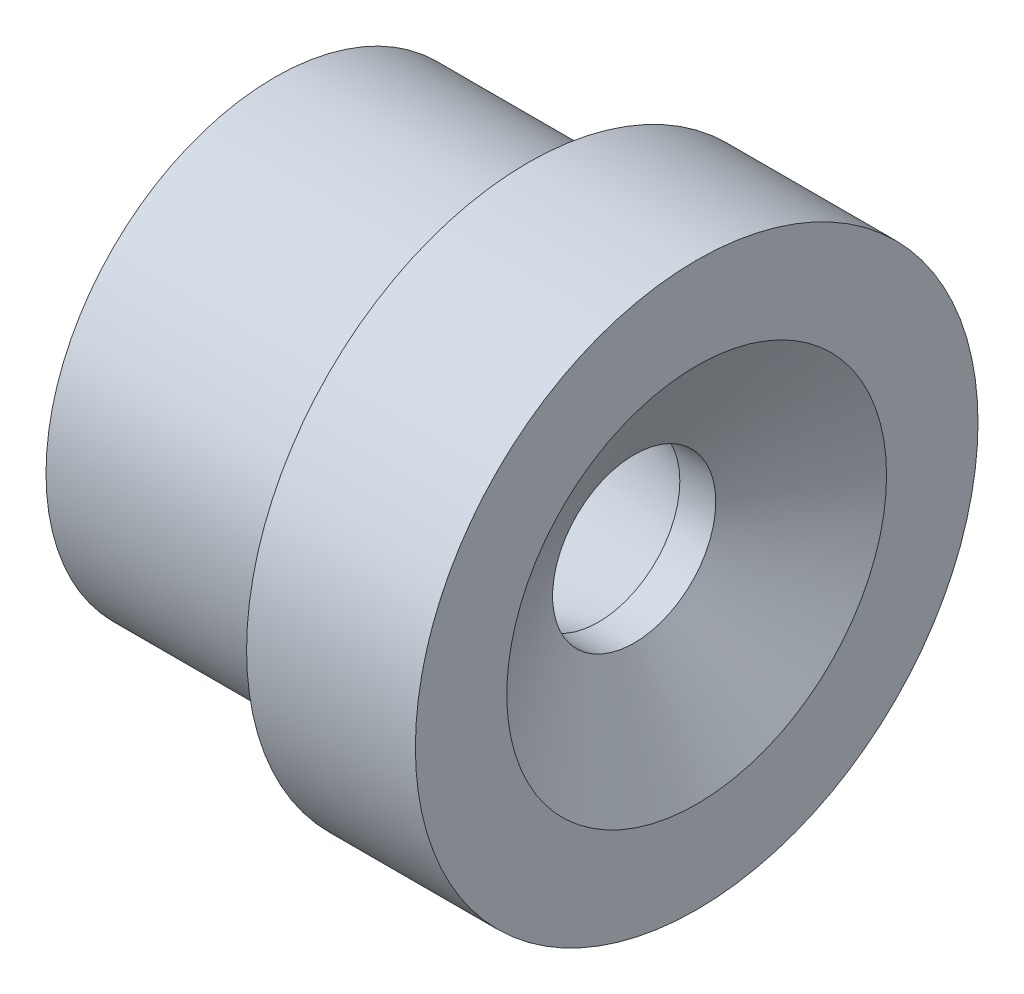
ISO-10303-21;
HEADER;
FILE_DESCRIPTION(('STEP AP214'),'2;1');
FILE_NAME('part.step','',(''),(''),'','','');
FILE_SCHEMA(('AUTOMOTIVE_DESIGN { 1 0 10303 214 1 1 1 1 }'));
ENDSEC;
DATA;
#1=APPLICATION_CONTEXT('core data for automotive mechanical design processes');
#2=APPLICATION_PROTOCOL_DEFINITION('international standard','automotive_design',2000,#1);
#3=PRODUCT_CONTEXT('',#1,'mechanical');
#4=PRODUCT('Part','Part','',(#3));
#5=PRODUCT_RELATED_PRODUCT_CATEGORY('part','',(#4));
#6=PRODUCT_DEFINITION_FORMATION('','',#4);
#7=PRODUCT_DEFINITION_CONTEXT('part definition',#1,'design');
#8=PRODUCT_DEFINITION('design','',#6,#7);
#9=PRODUCT_DEFINITION_SHAPE('','',#8);
#10=(LENGTH_UNIT() NAMED_UNIT(*) SI_UNIT(.MILLI.,.METRE.));
#11=(NAMED_UNIT(*) PLANE_ANGLE_UNIT() SI_UNIT($,.RADIAN.));
#12=(NAMED_UNIT(*) SI_UNIT($,.STERADIAN.) SOLID_ANGLE_UNIT());
#13=UNCERTAINTY_MEASURE_WITH_UNIT(LENGTH_MEASURE(1.E-05),#10,'distance_accuracy_value','');
#14=(GEOMETRIC_REPRESENTATION_CONTEXT(3) GLOBAL_UNCERTAINTY_ASSIGNED_CONTEXT((#13)) GLOBAL_UNIT_ASSIGNED_CONTEXT((#10,
#11,#12)) REPRESENTATION_CONTEXT('',''));
#15=CARTESIAN_POINT('',(0.,0.,0.));
#16=DIRECTION('',(0.,0.,1.));
#17=DIRECTION('',(1.,0.,0.));
#18=AXIS2_PLACEMENT_3D('',#15,#16,#17);
#19=CARTESIAN_POINT('',(5.11872970120267,0.,-12.7));
#20=DIRECTION('',(1.,0.,0.));
#21=DIRECTION('',(0.,0.,-1.));
#22=AXIS2_PLACEMENT_3D('',#19,#20,#21);
#23=CYLINDRICAL_SURFACE('',#22,12.7);
#24=CARTESIAN_POINT('',(0.,0.,-12.7));
#25=DIRECTION('',(1.,0.,0.));
#26=DIRECTION('',(0.,0.,-1.));
#27=AXIS2_PLACEMENT_3D('',#24,#25,#26);
#28=CIRCLE('',#27,12.7);
#29=CARTESIAN_POINT('',(0.,0.,-25.4));
#30=VERTEX_POINT('',#29);
#31=EDGE_CURVE('E10',#30,#30,#28,.T.);
#32=ORIENTED_EDGE('',*,*,#31,.F.);
#33=EDGE_LOOP('',(#32));
#34=FACE_BOUND('',#33,.T.);
#35=CARTESIAN_POINT('',(-7.62,0.,-12.7));
#36=DIRECTION('',(1.,0.,0.));
#37=DIRECTION('',(0.,0.,-1.));
#38=AXIS2_PLACEMENT_3D('',#35,#36,#37);
#39=CIRCLE('',#38,12.7);
#40=CARTESIAN_POINT('',(-7.62000000000001,0.,-25.4));
#41=VERTEX_POINT('',#40);
#42=EDGE_CURVE('E70',#41,#41,#39,.T.);
#43=ORIENTED_EDGE('',*,*,#42,.T.);
#44=EDGE_LOOP('',(#43));
#45=FACE_BOUND('',#44,.T.);
#46=ADVANCED_FACE('F39',(#34,#45),#23,.T.);
#47=CARTESIAN_POINT('',(0.,0.,0.));
#48=DIRECTION('',(-1.,0.,0.));
#49=DIRECTION('',(0.,0.,1.));
#50=AXIS2_PLACEMENT_3D('',#47,#48,#49);
#51=PLANE('',#50);
#52=CARTESIAN_POINT('',(0.,0.,-12.7));
#53=DIRECTION('',(1.,0.,0.));
#54=DIRECTION('',(0.,0.,-1.));
#55=AXIS2_PLACEMENT_3D('',#52,#53,#54);
#56=CIRCLE('',#55,8.5725);
#57=CARTESIAN_POINT('',(0.,0.,-21.2725));
#58=VERTEX_POINT('',#57);
#59=EDGE_CURVE('E44',#58,#58,#56,.T.);
#60=ORIENTED_EDGE('',*,*,#59,.F.);
#61=EDGE_LOOP('',(#60));
#62=FACE_BOUND('',#61,.T.);
#63=ORIENTED_EDGE('',*,*,#31,.T.);
#64=EDGE_LOOP('',(#63));
#65=FACE_BOUND('',#64,.T.);
#66=ADVANCED_FACE('F102',(#62,#65),#51,.F.);
#67=CARTESIAN_POINT('',(0.,0.,-12.7));
#68=DIRECTION('',(1.,0.,0.));
#69=DIRECTION('',(0.,0.,-1.));
#70=AXIS2_PLACEMENT_3D('',#67,#68,#69);
#71=CONICAL_SURFACE('',#70,8.5725,1.0471975511966);
#72=CARTESIAN_POINT('',(-2.82295414120266,0.,-12.7));
#73=DIRECTION('',(1.,0.,0.));
#74=DIRECTION('',(0.,0.,-1.));
#75=AXIS2_PLACEMENT_3D('',#72,#73,#74);
#76=CIRCLE('',#75,3.683);
#77=CARTESIAN_POINT('',(-2.82295414120267,0.,-16.383));
#78=VERTEX_POINT('',#77);
#79=EDGE_CURVE('E47',#78,#78,#76,.T.);
#80=ORIENTED_EDGE('',*,*,#79,.F.);
#81=EDGE_LOOP('',(#80));
#82=FACE_BOUND('',#81,.T.);
#83=ORIENTED_EDGE('',*,*,#59,.T.);
#84=EDGE_LOOP('',(#83));
#85=FACE_BOUND('',#84,.T.);
#86=ADVANCED_FACE('F97',(#82,#85),#71,.F.);
#87=CARTESIAN_POINT('',(5.11872970120267,0.,-12.7));
#88=DIRECTION('',(1.,0.,0.));
#89=DIRECTION('',(0.,0.,-1.));
#90=AXIS2_PLACEMENT_3D('',#87,#88,#89);
#91=CYLINDRICAL_SURFACE('',#90,3.683);
#92=CARTESIAN_POINT('',(-4.44347414120266,0.,-12.7));
#93=DIRECTION('',(1.,0.,0.));
#94=DIRECTION('',(0.,0.,-1.));
#95=AXIS2_PLACEMENT_3D('',#92,#93,#94);
#96=CIRCLE('',#95,3.683);
#97=CARTESIAN_POINT('',(-4.44347414120266,0.,-16.383));
#98=VERTEX_POINT('',#97);
#99=EDGE_CURVE('E52',#98,#98,#96,.T.);
#100=ORIENTED_EDGE('',*,*,#99,.F.);
#101=EDGE_LOOP('',(#100));
#102=FACE_BOUND('',#101,.T.);
#103=ORIENTED_EDGE('',*,*,#79,.T.);
#104=EDGE_LOOP('',(#103));
#105=FACE_BOUND('',#104,.T.);
#106=ADVANCED_FACE('F91',(#102,#105),#91,.F.);
#107=CARTESIAN_POINT('',(-4.44347414120266,0.,-12.7));
#108=DIRECTION('',(-1.,0.,0.));
#109=DIRECTION('',(0.,0.,1.));
#110=AXIS2_PLACEMENT_3D('',#107,#108,#109);
#111=CONICAL_SURFACE('',#110,3.683,0.26179938779915);
#112=CARTESIAN_POINT('',(-19.05,0.,-12.7));
#113=DIRECTION('',(1.,0.,0.));
#114=DIRECTION('',(0.,0.,-1.));
#115=AXIS2_PLACEMENT_3D('',#112,#113,#114);
#116=CIRCLE('',#115,7.59680680808906);
#117=CARTESIAN_POINT('',(-19.05,0.,-20.2968068080891));
#118=VERTEX_POINT('',#117);
#119=EDGE_CURVE('E59',#118,#118,#116,.T.);
#120=ORIENTED_EDGE('',*,*,#119,.F.);
#121=EDGE_LOOP('',(#120));
#122=FACE_BOUND('',#121,.T.);
#123=ORIENTED_EDGE('',*,*,#99,.T.);
#124=EDGE_LOOP('',(#123));
#125=FACE_BOUND('',#124,.T.);
#126=ADVANCED_FACE('F87',(#122,#125),#111,.F.);
#127=CARTESIAN_POINT('',(-19.05,0.,-5.10319319191093));
#128=DIRECTION('',(1.,0.,0.));
#129=DIRECTION('',(0.,0.,-1.));
#130=AXIS2_PLACEMENT_3D('',#127,#128,#129);
#131=PLANE('',#130);
#132=CARTESIAN_POINT('',(-19.05,0.,-12.7));
#133=DIRECTION('',(1.,0.,0.));
#134=DIRECTION('',(0.,0.,-1.));
#135=AXIS2_PLACEMENT_3D('',#132,#133,#134);
#136=CIRCLE('',#135,10.3251);
#137=CARTESIAN_POINT('',(-19.05,0.,-23.0251));
#138=VERTEX_POINT('',#137);
#139=EDGE_CURVE('E64',#138,#138,#136,.T.);
#140=ORIENTED_EDGE('',*,*,#139,.F.);
#141=EDGE_LOOP('',(#140));
#142=FACE_BOUND('',#141,.T.);
#143=ORIENTED_EDGE('',*,*,#119,.T.);
#144=EDGE_LOOP('',(#143));
#145=FACE_BOUND('',#144,.T.);
#146=ADVANCED_FACE('F82',(#142,#145),#131,.F.);
#147=CARTESIAN_POINT('',(5.11872970120267,0.,-12.7));
#148=DIRECTION('',(1.,0.,0.));
#149=DIRECTION('',(0.,0.,-1.));
#150=AXIS2_PLACEMENT_3D('',#147,#148,#149);
#151=CYLINDRICAL_SURFACE('',#150,10.3251);
#152=CARTESIAN_POINT('',(-7.62,0.,-12.7));
#153=DIRECTION('',(1.,0.,0.));
#154=DIRECTION('',(0.,0.,-1.));
#155=AXIS2_PLACEMENT_3D('',#152,#153,#154);
#156=CIRCLE('',#155,10.3251);
#157=CARTESIAN_POINT('',(-7.62,0.,-23.0251));
#158=VERTEX_POINT('',#157);
#159=EDGE_CURVE('E63',#158,#158,#156,.T.);
#160=ORIENTED_EDGE('',*,*,#159,.F.);
#161=EDGE_LOOP('',(#160));
#162=FACE_BOUND('',#161,.T.);
#163=ORIENTED_EDGE('',*,*,#139,.T.);
#164=EDGE_LOOP('',(#163));
#165=FACE_BOUND('',#164,.T.);
#166=ADVANCED_FACE('F73',(#162,#165),#151,.T.);
#167=CARTESIAN_POINT('',(-7.62,0.,-2.3749));
#168=DIRECTION('',(1.,0.,0.));
#169=DIRECTION('',(0.,0.,-1.));
#170=AXIS2_PLACEMENT_3D('',#167,#168,#169);
#171=PLANE('',#170);
#172=ORIENTED_EDGE('',*,*,#42,.F.);
#173=EDGE_LOOP('',(#172));
#174=FACE_BOUND('',#173,.T.);
#175=ORIENTED_EDGE('',*,*,#159,.T.);
#176=EDGE_LOOP('',(#175));
#177=FACE_BOUND('',#176,.T.);
#178=ADVANCED_FACE('F75',(#174,#177),#171,.F.);
#179=CLOSED_SHELL('',(#46,#66,#86,#106,#126,#146,#166,#178));
#180=MANIFOLD_SOLID_BREP('B2',#179);
#181=ADVANCED_BREP_SHAPE_REPRESENTATION('',(#18,#180),#14);
#182=SHAPE_DEFINITION_REPRESENTATION(#9,#181);
ENDSEC;
END-ISO-10303-21;
